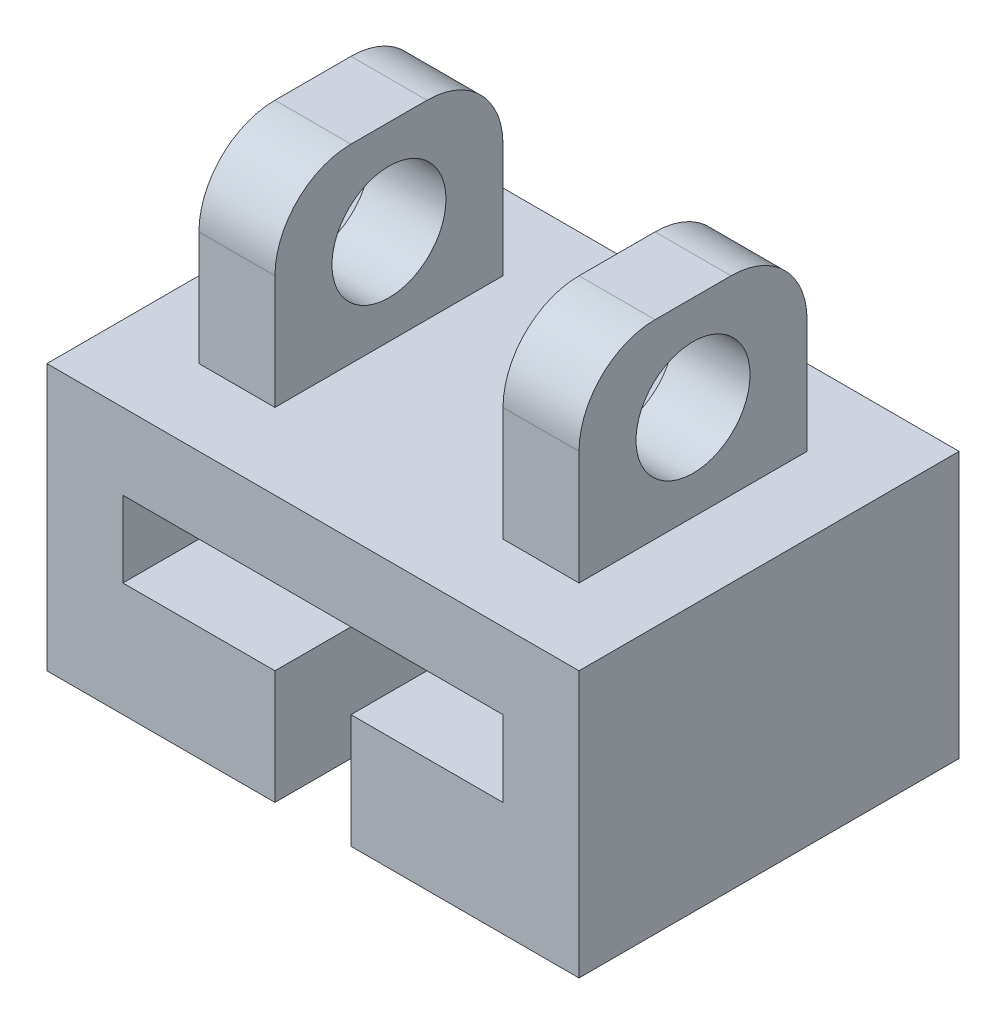
ISO-10303-21;
HEADER;
FILE_DESCRIPTION(('STEP AP214'),'2;1');
FILE_NAME('part.step','',(''),(''),'','','');
FILE_SCHEMA(('AUTOMOTIVE_DESIGN { 1 0 10303 214 1 1 1 1 }'));
ENDSEC;
DATA;
#1=APPLICATION_CONTEXT('core data for automotive mechanical design processes');
#2=APPLICATION_PROTOCOL_DEFINITION('international standard','automotive_design',2000,#1);
#3=PRODUCT_CONTEXT('',#1,'mechanical');
#4=PRODUCT('Part','Part','',(#3));
#5=PRODUCT_RELATED_PRODUCT_CATEGORY('part','',(#4));
#6=PRODUCT_DEFINITION_FORMATION('','',#4);
#7=PRODUCT_DEFINITION_CONTEXT('part definition',#1,'design');
#8=PRODUCT_DEFINITION('design','',#6,#7);
#9=PRODUCT_DEFINITION_SHAPE('','',#8);
#10=(LENGTH_UNIT() NAMED_UNIT(*) SI_UNIT(.MILLI.,.METRE.));
#11=(NAMED_UNIT(*) PLANE_ANGLE_UNIT() SI_UNIT($,.RADIAN.));
#12=(NAMED_UNIT(*) SI_UNIT($,.STERADIAN.) SOLID_ANGLE_UNIT());
#13=UNCERTAINTY_MEASURE_WITH_UNIT(LENGTH_MEASURE(1.E-05),#10,'distance_accuracy_value','');
#14=(GEOMETRIC_REPRESENTATION_CONTEXT(3) GLOBAL_UNCERTAINTY_ASSIGNED_CONTEXT((#13)) GLOBAL_UNIT_ASSIGNED_CONTEXT((#10,
#11,#12)) REPRESENTATION_CONTEXT('',''));
#15=CARTESIAN_POINT('',(0.,0.,0.));
#16=DIRECTION('',(0.,0.,1.));
#17=DIRECTION('',(1.,0.,0.));
#18=AXIS2_PLACEMENT_3D('',#15,#16,#17);
#19=CARTESIAN_POINT('',(-80.8662040418797,3.69369369369371,100.));
#20=DIRECTION('',(0.,-1.,0.));
#21=DIRECTION('',(0.,0.,-1.));
#22=AXIS2_PLACEMENT_3D('',#19,#20,#21);
#23=PLANE('',#22);
#24=DIRECTION('',(0.,0.,-1.));
#25=VECTOR('',#24,1.);
#26=CARTESIAN_POINT('',(-40.8662040418798,3.69369369369371,20.));
#27=LINE('',#26,#25);
#28=CARTESIAN_POINT('',(-40.8662040418798,3.69369369369371,80.));
#29=VERTEX_POINT('',#28);
#30=CARTESIAN_POINT('',(-40.8662040418798,3.69369369369371,20.));
#31=VERTEX_POINT('',#30);
#32=EDGE_CURVE('E243',#29,#31,#27,.T.);
#33=ORIENTED_EDGE('',*,*,#32,.F.);
#34=DIRECTION('',(1.,0.,0.));
#35=VECTOR('',#34,1.);
#36=CARTESIAN_POINT('',(-60.8662040418798,3.69369369369371,80.));
#37=LINE('',#36,#35);
#38=CARTESIAN_POINT('',(-60.8662040418798,3.69369369369371,80.));
#39=VERTEX_POINT('',#38);
#40=EDGE_CURVE('E249',#39,#29,#37,.T.);
#41=ORIENTED_EDGE('',*,*,#40,.F.);
#42=DIRECTION('',(0.,0.,1.));
#43=VECTOR('',#42,1.);
#44=CARTESIAN_POINT('',(-60.8662040418798,3.69369369369371,20.));
#45=LINE('',#44,#43);
#46=CARTESIAN_POINT('',(-60.8662040418798,3.69369369369371,20.));
#47=VERTEX_POINT('',#46);
#48=EDGE_CURVE('E261',#47,#39,#45,.T.);
#49=ORIENTED_EDGE('',*,*,#48,.F.);
#50=DIRECTION('',(-1.,0.,0.));
#51=VECTOR('',#50,1.);
#52=CARTESIAN_POINT('',(-60.8662040418798,3.69369369369371,20.));
#53=LINE('',#52,#51);
#54=EDGE_CURVE('E257',#31,#47,#53,.T.);
#55=ORIENTED_EDGE('',*,*,#54,.F.);
#56=EDGE_LOOP('',(#33,#41,#49,#55));
#57=FACE_BOUND('',#56,.T.);
#58=DIRECTION('',(-1.,0.,0.));
#59=VECTOR('',#58,1.);
#60=CARTESIAN_POINT('',(-80.8662040418797,3.69369369369371,0.));
#61=LINE('',#60,#59);
#62=CARTESIAN_POINT('',(59.1337959581202,3.69369369369371,0.));
#63=VERTEX_POINT('',#62);
#64=CARTESIAN_POINT('',(-80.8662040418797,3.69369369369371,0.));
#65=VERTEX_POINT('',#64);
#66=EDGE_CURVE('E320',#63,#65,#61,.T.);
#67=ORIENTED_EDGE('',*,*,#66,.T.);
#68=DIRECTION('',(0.,0.,-1.));
#69=VECTOR('',#68,1.);
#70=CARTESIAN_POINT('',(-80.8662040418797,3.69369369369371,100.));
#71=LINE('',#70,#69);
#72=CARTESIAN_POINT('',(-80.8662040418797,3.69369369369371,100.));
#73=VERTEX_POINT('',#72);
#74=EDGE_CURVE('E395',#73,#65,#71,.T.);
#75=ORIENTED_EDGE('',*,*,#74,.F.);
#76=DIRECTION('',(-1.,0.,0.));
#77=VECTOR('',#76,1.);
#78=CARTESIAN_POINT('',(-80.8662040418797,3.69369369369371,100.));
#79=LINE('',#78,#77);
#80=CARTESIAN_POINT('',(59.1337959581202,3.69369369369371,100.));
#81=VERTEX_POINT('',#80);
#82=EDGE_CURVE('E283',#81,#73,#79,.T.);
#83=ORIENTED_EDGE('',*,*,#82,.F.);
#84=DIRECTION('',(0.,0.,-1.));
#85=VECTOR('',#84,1.);
#86=CARTESIAN_POINT('',(59.1337959581202,3.69369369369371,100.));
#87=LINE('',#86,#85);
#88=EDGE_CURVE('E399',#81,#63,#87,.T.);
#89=ORIENTED_EDGE('',*,*,#88,.T.);
#90=EDGE_LOOP('',(#67,#75,#83,#89));
#91=FACE_BOUND('',#90,.T.);
#92=DIRECTION('',(0.,0.,-1.));
#93=VECTOR('',#92,1.);
#94=CARTESIAN_POINT('',(39.1337959581202,3.69369369369371,20.));
#95=LINE('',#94,#93);
#96=CARTESIAN_POINT('',(39.1337959581202,3.69369369369371,80.));
#97=VERTEX_POINT('',#96);
#98=CARTESIAN_POINT('',(39.1337959581202,3.69369369369371,20.));
#99=VERTEX_POINT('',#98);
#100=EDGE_CURVE('E203',#97,#99,#95,.T.);
#101=ORIENTED_EDGE('',*,*,#100,.F.);
#102=DIRECTION('',(1.,0.,0.));
#103=VECTOR('',#102,1.);
#104=CARTESIAN_POINT('',(19.1337959581202,3.69369369369371,80.));
#105=LINE('',#104,#103);
#106=CARTESIAN_POINT('',(19.1337959581202,3.69369369369371,80.));
#107=VERTEX_POINT('',#106);
#108=EDGE_CURVE('E215',#107,#97,#105,.T.);
#109=ORIENTED_EDGE('',*,*,#108,.F.);
#110=DIRECTION('',(0.,0.,1.));
#111=VECTOR('',#110,1.);
#112=CARTESIAN_POINT('',(19.1337959581202,3.69369369369371,20.));
#113=LINE('',#112,#111);
#114=CARTESIAN_POINT('',(19.1337959581202,3.69369369369371,20.));
#115=VERTEX_POINT('',#114);
#116=EDGE_CURVE('E226',#115,#107,#113,.T.);
#117=ORIENTED_EDGE('',*,*,#116,.F.);
#118=DIRECTION('',(-1.,0.,0.));
#119=VECTOR('',#118,1.);
#120=CARTESIAN_POINT('',(19.1337959581202,3.69369369369371,20.));
#121=LINE('',#120,#119);
#122=EDGE_CURVE('E218',#99,#115,#121,.T.);
#123=ORIENTED_EDGE('',*,*,#122,.F.);
#124=EDGE_LOOP('',(#101,#109,#117,#123));
#125=FACE_BOUND('',#124,.T.);
#126=ADVANCED_FACE('F39',(#57,#91,#125),#23,.F.);
#127=CARTESIAN_POINT('',(59.1337959581202,3.69369369369371,100.));
#128=DIRECTION('',(-1.,0.,0.));
#129=DIRECTION('',(0.,-1.,0.));
#130=AXIS2_PLACEMENT_3D('',#127,#128,#129);
#131=PLANE('',#130);
#132=DIRECTION('',(0.,1.,0.));
#133=VECTOR('',#132,1.);
#134=CARTESIAN_POINT('',(59.1337959581202,3.69369369369371,0.));
#135=LINE('',#134,#133);
#136=CARTESIAN_POINT('',(59.1337959581203,-66.3063063063063,0.));
#137=VERTEX_POINT('',#136);
#138=EDGE_CURVE('E279',#137,#63,#135,.T.);
#139=ORIENTED_EDGE('',*,*,#138,.T.);
#140=ORIENTED_EDGE('',*,*,#88,.F.);
#141=DIRECTION('',(0.,1.,0.));
#142=VECTOR('',#141,1.);
#143=CARTESIAN_POINT('',(59.1337959581202,-13.6936936936937,100.));
#144=LINE('',#143,#142);
#145=CARTESIAN_POINT('',(59.1337959581203,-66.3063063063063,100.));
#146=VERTEX_POINT('',#145);
#147=EDGE_CURVE('E280',#146,#81,#144,.T.);
#148=ORIENTED_EDGE('',*,*,#147,.F.);
#149=DIRECTION('',(0.,0.,-1.));
#150=VECTOR('',#149,1.);
#151=CARTESIAN_POINT('',(59.1337959581203,-66.3063063063063,100.));
#152=LINE('',#151,#150);
#153=EDGE_CURVE('E317',#146,#137,#152,.T.);
#154=ORIENTED_EDGE('',*,*,#153,.T.);
#155=EDGE_LOOP('',(#139,#140,#148,#154));
#156=FACE_BOUND('',#155,.T.);
#157=ADVANCED_FACE('F494',(#156),#131,.F.);
#158=CARTESIAN_POINT('',(-80.8662040418798,-13.6936936936937,100.));
#159=DIRECTION('',(1.,0.,0.));
#160=DIRECTION('',(0.,1.,0.));
#161=AXIS2_PLACEMENT_3D('',#158,#159,#160);
#162=PLANE('',#161);
#163=DIRECTION('',(0.,-1.,0.));
#164=VECTOR('',#163,1.);
#165=CARTESIAN_POINT('',(-80.8662040418798,-13.6936936936937,0.));
#166=LINE('',#165,#164);
#167=CARTESIAN_POINT('',(-80.8662040418798,-66.3063063063063,0.));
#168=VERTEX_POINT('',#167);
#169=EDGE_CURVE('E324',#65,#168,#166,.T.);
#170=ORIENTED_EDGE('',*,*,#169,.T.);
#171=DIRECTION('',(0.,0.,-1.));
#172=VECTOR('',#171,1.);
#173=CARTESIAN_POINT('',(-80.8662040418798,-66.3063063063063,100.));
#174=LINE('',#173,#172);
#175=CARTESIAN_POINT('',(-80.8662040418798,-66.3063063063063,100.));
#176=VERTEX_POINT('',#175);
#177=EDGE_CURVE('E391',#176,#168,#174,.T.);
#178=ORIENTED_EDGE('',*,*,#177,.F.);
#179=DIRECTION('',(0.,-1.,0.));
#180=VECTOR('',#179,1.);
#181=CARTESIAN_POINT('',(-80.8662040418797,3.69369369369371,100.));
#182=LINE('',#181,#180);
#183=EDGE_CURVE('E287',#73,#176,#182,.T.);
#184=ORIENTED_EDGE('',*,*,#183,.F.);
#185=ORIENTED_EDGE('',*,*,#74,.T.);
#186=EDGE_LOOP('',(#170,#178,#184,#185));
#187=FACE_BOUND('',#186,.T.);
#188=ADVANCED_FACE('F502',(#187),#162,.F.);
#189=CARTESIAN_POINT('',(-60.,-66.3063063063063,100.));
#190=DIRECTION('',(0.,1.,0.));
#191=DIRECTION('',(0.,0.,1.));
#192=AXIS2_PLACEMENT_3D('',#189,#190,#191);
#193=PLANE('',#192);
#194=DIRECTION('',(1.,0.,0.));
#195=VECTOR('',#194,1.);
#196=CARTESIAN_POINT('',(-60.,-66.3063063063063,0.));
#197=LINE('',#196,#195);
#198=CARTESIAN_POINT('',(-20.8662040418798,-66.3063063063063,0.));
#199=VERTEX_POINT('',#198);
#200=EDGE_CURVE('E328',#168,#199,#197,.T.);
#201=ORIENTED_EDGE('',*,*,#200,.T.);
#202=DIRECTION('',(0.,0.,-1.));
#203=VECTOR('',#202,1.);
#204=CARTESIAN_POINT('',(-20.8662040418798,-66.3063063063063,100.));
#205=LINE('',#204,#203);
#206=CARTESIAN_POINT('',(-20.8662040418798,-66.3063063063063,100.));
#207=VERTEX_POINT('',#206);
#208=EDGE_CURVE('E387',#207,#199,#205,.T.);
#209=ORIENTED_EDGE('',*,*,#208,.F.);
#210=DIRECTION('',(1.,0.,0.));
#211=VECTOR('',#210,1.);
#212=CARTESIAN_POINT('',(-80.8662040418798,-66.3063063063063,100.));
#213=LINE('',#212,#211);
#214=EDGE_CURVE('E290',#176,#207,#213,.T.);
#215=ORIENTED_EDGE('',*,*,#214,.F.);
#216=ORIENTED_EDGE('',*,*,#177,.T.);
#217=EDGE_LOOP('',(#201,#209,#215,#216));
#218=FACE_BOUND('',#217,.T.);
#219=ADVANCED_FACE('F663',(#218),#193,.F.);
#220=CARTESIAN_POINT('',(-20.8662040418798,-66.3063063063063,100.));
#221=DIRECTION('',(-1.,0.,0.));
#222=DIRECTION('',(0.,0.,1.));
#223=AXIS2_PLACEMENT_3D('',#220,#221,#222);
#224=PLANE('',#223);
#225=DIRECTION('',(0.,1.,0.));
#226=VECTOR('',#225,1.);
#227=CARTESIAN_POINT('',(-20.8662040418798,-66.3063063063063,0.));
#228=LINE('',#227,#226);
#229=CARTESIAN_POINT('',(-20.8662040418798,-36.3063063063063,0.));
#230=VERTEX_POINT('',#229);
#231=EDGE_CURVE('E331',#199,#230,#228,.T.);
#232=ORIENTED_EDGE('',*,*,#231,.T.);
#233=DIRECTION('',(0.,0.,-1.));
#234=VECTOR('',#233,1.);
#235=CARTESIAN_POINT('',(-20.8662040418798,-36.3063063063063,100.));
#236=LINE('',#235,#234);
#237=CARTESIAN_POINT('',(-20.8662040418798,-36.3063063063063,100.));
#238=VERTEX_POINT('',#237);
#239=EDGE_CURVE('E383',#238,#230,#236,.T.);
#240=ORIENTED_EDGE('',*,*,#239,.F.);
#241=DIRECTION('',(0.,1.,0.));
#242=VECTOR('',#241,1.);
#243=CARTESIAN_POINT('',(-20.8662040418798,-66.3063063063063,100.));
#244=LINE('',#243,#242);
#245=EDGE_CURVE('E293',#207,#238,#244,.T.);
#246=ORIENTED_EDGE('',*,*,#245,.F.);
#247=ORIENTED_EDGE('',*,*,#208,.T.);
#248=EDGE_LOOP('',(#232,#240,#246,#247));
#249=FACE_BOUND('',#248,.T.);
#250=ADVANCED_FACE('F660',(#249),#224,.F.);
#251=CARTESIAN_POINT('',(-60.8662040418798,-36.3063063063063,100.));
#252=DIRECTION('',(0.,-1.,0.));
#253=DIRECTION('',(0.,0.,-1.));
#254=AXIS2_PLACEMENT_3D('',#251,#252,#253);
#255=PLANE('',#254);
#256=DIRECTION('',(-1.,0.,0.));
#257=VECTOR('',#256,1.);
#258=CARTESIAN_POINT('',(-60.8662040418798,-36.3063063063063,0.));
#259=LINE('',#258,#257);
#260=CARTESIAN_POINT('',(-60.8662040418798,-36.3063063063063,0.));
#261=VERTEX_POINT('',#260);
#262=EDGE_CURVE('E334',#230,#261,#259,.T.);
#263=ORIENTED_EDGE('',*,*,#262,.T.);
#264=DIRECTION('',(0.,0.,-1.));
#265=VECTOR('',#264,1.);
#266=CARTESIAN_POINT('',(-60.8662040418798,-36.3063063063063,100.));
#267=LINE('',#266,#265);
#268=CARTESIAN_POINT('',(-60.8662040418798,-36.3063063063063,100.));
#269=VERTEX_POINT('',#268);
#270=EDGE_CURVE('E379',#269,#261,#267,.T.);
#271=ORIENTED_EDGE('',*,*,#270,.F.);
#272=DIRECTION('',(-1.,0.,0.));
#273=VECTOR('',#272,1.);
#274=CARTESIAN_POINT('',(-60.8662040418798,-36.3063063063063,100.));
#275=LINE('',#274,#273);
#276=EDGE_CURVE('E296',#238,#269,#275,.T.);
#277=ORIENTED_EDGE('',*,*,#276,.F.);
#278=ORIENTED_EDGE('',*,*,#239,.T.);
#279=EDGE_LOOP('',(#263,#271,#277,#278));
#280=FACE_BOUND('',#279,.T.);
#281=ADVANCED_FACE('F656',(#280),#255,.F.);
#282=CARTESIAN_POINT('',(-60.8662040418798,-16.3063063063063,100.));
#283=DIRECTION('',(-1.,0.,0.));
#284=DIRECTION('',(0.,0.,1.));
#285=AXIS2_PLACEMENT_3D('',#282,#283,#284);
#286=PLANE('',#285);
#287=DIRECTION('',(0.,1.,0.));
#288=VECTOR('',#287,1.);
#289=CARTESIAN_POINT('',(-60.8662040418798,-16.3063063063063,0.));
#290=LINE('',#289,#288);
#291=CARTESIAN_POINT('',(-60.8662040418798,-16.3063063063063,0.));
#292=VERTEX_POINT('',#291);
#293=EDGE_CURVE('E337',#261,#292,#290,.T.);
#294=ORIENTED_EDGE('',*,*,#293,.T.);
#295=DIRECTION('',(0.,0.,-1.));
#296=VECTOR('',#295,1.);
#297=CARTESIAN_POINT('',(-60.8662040418798,-16.3063063063063,100.));
#298=LINE('',#297,#296);
#299=CARTESIAN_POINT('',(-60.8662040418798,-16.3063063063063,100.));
#300=VERTEX_POINT('',#299);
#301=EDGE_CURVE('E375',#300,#292,#298,.T.);
#302=ORIENTED_EDGE('',*,*,#301,.F.);
#303=DIRECTION('',(0.,1.,0.));
#304=VECTOR('',#303,1.);
#305=CARTESIAN_POINT('',(-60.8662040418798,-16.3063063063063,100.));
#306=LINE('',#305,#304);
#307=EDGE_CURVE('E299',#269,#300,#306,.T.);
#308=ORIENTED_EDGE('',*,*,#307,.F.);
#309=ORIENTED_EDGE('',*,*,#270,.T.);
#310=EDGE_LOOP('',(#294,#302,#308,#309));
#311=FACE_BOUND('',#310,.T.);
#312=ADVANCED_FACE('F652',(#311),#286,.F.);
#313=CARTESIAN_POINT('',(-60.8662040418798,-16.3063063063063,100.));
#314=DIRECTION('',(0.,1.,0.));
#315=DIRECTION('',(0.,0.,1.));
#316=AXIS2_PLACEMENT_3D('',#313,#314,#315);
#317=PLANE('',#316);
#318=DIRECTION('',(1.,0.,0.));
#319=VECTOR('',#318,1.);
#320=CARTESIAN_POINT('',(-60.8662040418798,-16.3063063063063,0.));
#321=LINE('',#320,#319);
#322=CARTESIAN_POINT('',(39.1337959581202,-16.3063063063063,0.));
#323=VERTEX_POINT('',#322);
#324=EDGE_CURVE('E340',#292,#323,#321,.T.);
#325=ORIENTED_EDGE('',*,*,#324,.T.);
#326=DIRECTION('',(0.,0.,-1.));
#327=VECTOR('',#326,1.);
#328=CARTESIAN_POINT('',(39.1337959581202,-16.3063063063063,100.));
#329=LINE('',#328,#327);
#330=CARTESIAN_POINT('',(39.1337959581202,-16.3063063063063,100.));
#331=VERTEX_POINT('',#330);
#332=EDGE_CURVE('E371',#331,#323,#329,.T.);
#333=ORIENTED_EDGE('',*,*,#332,.F.);
#334=DIRECTION('',(1.,0.,0.));
#335=VECTOR('',#334,1.);
#336=CARTESIAN_POINT('',(-60.8662040418798,-16.3063063063063,100.));
#337=LINE('',#336,#335);
#338=EDGE_CURVE('E302',#300,#331,#337,.T.);
#339=ORIENTED_EDGE('',*,*,#338,.F.);
#340=ORIENTED_EDGE('',*,*,#301,.T.);
#341=EDGE_LOOP('',(#325,#333,#339,#340));
#342=FACE_BOUND('',#341,.T.);
#343=ADVANCED_FACE('F648',(#342),#317,.F.);
#344=CARTESIAN_POINT('',(39.1337959581202,-16.3063063063063,100.));
#345=DIRECTION('',(1.,0.,0.));
#346=DIRECTION('',(0.,0.,-1.));
#347=AXIS2_PLACEMENT_3D('',#344,#345,#346);
#348=PLANE('',#347);
#349=DIRECTION('',(0.,-1.,0.));
#350=VECTOR('',#349,1.);
#351=CARTESIAN_POINT('',(39.1337959581202,-16.3063063063063,0.));
#352=LINE('',#351,#350);
#353=CARTESIAN_POINT('',(39.1337959581202,-36.3063063063063,0.));
#354=VERTEX_POINT('',#353);
#355=EDGE_CURVE('E343',#323,#354,#352,.T.);
#356=ORIENTED_EDGE('',*,*,#355,.T.);
#357=DIRECTION('',(0.,0.,-1.));
#358=VECTOR('',#357,1.);
#359=CARTESIAN_POINT('',(39.1337959581202,-36.3063063063063,100.));
#360=LINE('',#359,#358);
#361=CARTESIAN_POINT('',(39.1337959581202,-36.3063063063063,100.));
#362=VERTEX_POINT('',#361);
#363=EDGE_CURVE('E367',#362,#354,#360,.T.);
#364=ORIENTED_EDGE('',*,*,#363,.F.);
#365=DIRECTION('',(0.,-1.,0.));
#366=VECTOR('',#365,1.);
#367=CARTESIAN_POINT('',(39.1337959581202,-16.3063063063063,100.));
#368=LINE('',#367,#366);
#369=EDGE_CURVE('E305',#331,#362,#368,.T.);
#370=ORIENTED_EDGE('',*,*,#369,.F.);
#371=ORIENTED_EDGE('',*,*,#332,.T.);
#372=EDGE_LOOP('',(#356,#364,#370,#371));
#373=FACE_BOUND('',#372,.T.);
#374=ADVANCED_FACE('F644',(#373),#348,.F.);
#375=CARTESIAN_POINT('',(39.1337959581202,-36.3063063063063,100.));
#376=DIRECTION('',(0.,-1.,0.));
#377=DIRECTION('',(0.,0.,-1.));
#378=AXIS2_PLACEMENT_3D('',#375,#376,#377);
#379=PLANE('',#378);
#380=DIRECTION('',(-1.,0.,0.));
#381=VECTOR('',#380,1.);
#382=CARTESIAN_POINT('',(39.1337959581202,-36.3063063063063,0.));
#383=LINE('',#382,#381);
#384=CARTESIAN_POINT('',(-0.866204041879759,-36.3063063063063,0.));
#385=VERTEX_POINT('',#384);
#386=EDGE_CURVE('E346',#354,#385,#383,.T.);
#387=ORIENTED_EDGE('',*,*,#386,.T.);
#388=DIRECTION('',(0.,0.,-1.));
#389=VECTOR('',#388,1.);
#390=CARTESIAN_POINT('',(-0.866204041879759,-36.3063063063063,100.));
#391=LINE('',#390,#389);
#392=CARTESIAN_POINT('',(-0.866204041879759,-36.3063063063063,100.));
#393=VERTEX_POINT('',#392);
#394=EDGE_CURVE('E363',#393,#385,#391,.T.);
#395=ORIENTED_EDGE('',*,*,#394,.F.);
#396=DIRECTION('',(-1.,0.,0.));
#397=VECTOR('',#396,1.);
#398=CARTESIAN_POINT('',(39.1337959581202,-36.3063063063063,100.));
#399=LINE('',#398,#397);
#400=EDGE_CURVE('E308',#362,#393,#399,.T.);
#401=ORIENTED_EDGE('',*,*,#400,.F.);
#402=ORIENTED_EDGE('',*,*,#363,.T.);
#403=EDGE_LOOP('',(#387,#395,#401,#402));
#404=FACE_BOUND('',#403,.T.);
#405=ADVANCED_FACE('F640',(#404),#379,.F.);
#406=CARTESIAN_POINT('',(-0.866204041879759,-66.3063063063063,100.));
#407=DIRECTION('',(1.,0.,0.));
#408=DIRECTION('',(0.,0.,-1.));
#409=AXIS2_PLACEMENT_3D('',#406,#407,#408);
#410=PLANE('',#409);
#411=DIRECTION('',(0.,-1.,0.));
#412=VECTOR('',#411,1.);
#413=CARTESIAN_POINT('',(-0.866204041879759,-66.3063063063063,0.));
#414=LINE('',#413,#412);
#415=CARTESIAN_POINT('',(-0.866204041879759,-66.3063063063063,0.));
#416=VERTEX_POINT('',#415);
#417=EDGE_CURVE('E349',#385,#416,#414,.T.);
#418=ORIENTED_EDGE('',*,*,#417,.T.);
#419=DIRECTION('',(0.,0.,-1.));
#420=VECTOR('',#419,1.);
#421=CARTESIAN_POINT('',(-0.866204041879759,-66.3063063063063,100.));
#422=LINE('',#421,#420);
#423=CARTESIAN_POINT('',(-0.866204041879759,-66.3063063063063,100.));
#424=VERTEX_POINT('',#423);
#425=EDGE_CURVE('E359',#424,#416,#422,.T.);
#426=ORIENTED_EDGE('',*,*,#425,.F.);
#427=DIRECTION('',(0.,-1.,0.));
#428=VECTOR('',#427,1.);
#429=CARTESIAN_POINT('',(-0.866204041879759,-66.3063063063063,100.));
#430=LINE('',#429,#428);
#431=EDGE_CURVE('E311',#393,#424,#430,.T.);
#432=ORIENTED_EDGE('',*,*,#431,.F.);
#433=ORIENTED_EDGE('',*,*,#394,.T.);
#434=EDGE_LOOP('',(#418,#426,#432,#433));
#435=FACE_BOUND('',#434,.T.);
#436=ADVANCED_FACE('F636',(#435),#410,.F.);
#437=CARTESIAN_POINT('',(59.1337959581203,-66.3063063063063,100.));
#438=DIRECTION('',(0.,1.,0.));
#439=DIRECTION('',(0.,0.,1.));
#440=AXIS2_PLACEMENT_3D('',#437,#438,#439);
#441=PLANE('',#440);
#442=DIRECTION('',(1.,0.,0.));
#443=VECTOR('',#442,1.);
#444=CARTESIAN_POINT('',(59.1337959581203,-66.3063063063063,0.));
#445=LINE('',#444,#443);
#446=EDGE_CURVE('E284',#416,#137,#445,.T.);
#447=ORIENTED_EDGE('',*,*,#446,.T.);
#448=ORIENTED_EDGE('',*,*,#153,.F.);
#449=DIRECTION('',(1.,0.,0.));
#450=VECTOR('',#449,1.);
#451=CARTESIAN_POINT('',(38.2675919162405,-66.3063063063063,100.));
#452=LINE('',#451,#450);
#453=EDGE_CURVE('E314',#424,#146,#452,.T.);
#454=ORIENTED_EDGE('',*,*,#453,.F.);
#455=ORIENTED_EDGE('',*,*,#425,.T.);
#456=EDGE_LOOP('',(#447,#448,#454,#455));
#457=FACE_BOUND('',#456,.T.);
#458=ADVANCED_FACE('F629',(#457),#441,.F.);
#459=CARTESIAN_POINT('',(0.,0.,100.));
#460=DIRECTION('',(0.,0.,-1.));
#461=DIRECTION('',(-1.,0.,0.));
#462=AXIS2_PLACEMENT_3D('',#459,#460,#461);
#463=PLANE('',#462);
#464=ORIENTED_EDGE('',*,*,#147,.T.);
#465=ORIENTED_EDGE('',*,*,#82,.T.);
#466=ORIENTED_EDGE('',*,*,#183,.T.);
#467=ORIENTED_EDGE('',*,*,#214,.T.);
#468=ORIENTED_EDGE('',*,*,#245,.T.);
#469=ORIENTED_EDGE('',*,*,#276,.T.);
#470=ORIENTED_EDGE('',*,*,#307,.T.);
#471=ORIENTED_EDGE('',*,*,#338,.T.);
#472=ORIENTED_EDGE('',*,*,#369,.T.);
#473=ORIENTED_EDGE('',*,*,#400,.T.);
#474=ORIENTED_EDGE('',*,*,#431,.T.);
#475=ORIENTED_EDGE('',*,*,#453,.T.);
#476=EDGE_LOOP('',(#464,#465,#466,#467,#468,#469,#470,#471,#472,#473,#474,#475));
#477=FACE_BOUND('',#476,.T.);
#478=ADVANCED_FACE('F626',(#477),#463,.F.);
#479=CARTESIAN_POINT('',(0.,0.,0.));
#480=DIRECTION('',(0.,0.,-1.));
#481=DIRECTION('',(-1.,0.,0.));
#482=AXIS2_PLACEMENT_3D('',#479,#480,#481);
#483=PLANE('',#482);
#484=ORIENTED_EDGE('',*,*,#138,.F.);
#485=ORIENTED_EDGE('',*,*,#446,.F.);
#486=ORIENTED_EDGE('',*,*,#417,.F.);
#487=ORIENTED_EDGE('',*,*,#386,.F.);
#488=ORIENTED_EDGE('',*,*,#355,.F.);
#489=ORIENTED_EDGE('',*,*,#324,.F.);
#490=ORIENTED_EDGE('',*,*,#293,.F.);
#491=ORIENTED_EDGE('',*,*,#262,.F.);
#492=ORIENTED_EDGE('',*,*,#231,.F.);
#493=ORIENTED_EDGE('',*,*,#200,.F.);
#494=ORIENTED_EDGE('',*,*,#169,.F.);
#495=ORIENTED_EDGE('',*,*,#66,.F.);
#496=EDGE_LOOP('',(#484,#485,#486,#487,#488,#489,#490,#491,#492,#493,#494,#495));
#497=FACE_BOUND('',#496,.T.);
#498=ADVANCED_FACE('F538',(#497),#483,.T.);
#499=CARTESIAN_POINT('',(-40.8662040418798,53.6936936936937,20.));
#500=DIRECTION('',(-1.,0.,0.));
#501=DIRECTION('',(0.,0.,1.));
#502=AXIS2_PLACEMENT_3D('',#499,#500,#501);
#503=PLANE('',#502);
#504=CARTESIAN_POINT('',(-40.8662040418798,28.6936936936937,50.));
#505=DIRECTION('',(-1.,0.,0.));
#506=DIRECTION('',(0.,0.,1.));
#507=AXIS2_PLACEMENT_3D('',#504,#505,#506);
#508=CIRCLE('',#507,15.);
#509=CARTESIAN_POINT('',(-40.8662040418798,28.6936936936937,35.));
#510=VERTEX_POINT('',#509);
#511=EDGE_CURVE('E220',#510,#510,#508,.T.);
#512=ORIENTED_EDGE('',*,*,#511,.T.);
#513=EDGE_LOOP('',(#512));
#514=FACE_BOUND('',#513,.T.);
#515=DIRECTION('',(0.,0.,-1.));
#516=VECTOR('',#515,1.);
#517=CARTESIAN_POINT('',(-40.8662040418798,53.6936936936937,20.));
#518=LINE('',#517,#516);
#519=CARTESIAN_POINT('',(-40.8662040418798,53.6936936936937,60.));
#520=VERTEX_POINT('',#519);
#521=CARTESIAN_POINT('',(-40.8662040418798,53.6936936936937,40.));
#522=VERTEX_POINT('',#521);
#523=EDGE_CURVE('E244',#520,#522,#518,.T.);
#524=ORIENTED_EDGE('',*,*,#523,.F.);
#525=CARTESIAN_POINT('',(-40.8662040418798,33.6936936936937,60.));
#526=DIRECTION('',(-1.,0.,0.));
#527=DIRECTION('',(0.,0.,1.));
#528=AXIS2_PLACEMENT_3D('',#525,#526,#527);
#529=CIRCLE('',#528,20.);
#530=CARTESIAN_POINT('',(-40.8662040418798,33.6936936936937,80.));
#531=VERTEX_POINT('',#530);
#532=EDGE_CURVE('E414',#520,#531,#529,.F.);
#533=ORIENTED_EDGE('',*,*,#532,.T.);
#534=DIRECTION('',(0.,-1.,0.));
#535=VECTOR('',#534,1.);
#536=CARTESIAN_POINT('',(-40.8662040418798,53.6936936936937,80.));
#537=LINE('',#536,#535);
#538=EDGE_CURVE('E253',#531,#29,#537,.T.);
#539=ORIENTED_EDGE('',*,*,#538,.T.);
#540=ORIENTED_EDGE('',*,*,#32,.T.);
#541=DIRECTION('',(0.,-1.,0.));
#542=VECTOR('',#541,1.);
#543=CARTESIAN_POINT('',(-40.8662040418798,53.6936936936937,20.));
#544=LINE('',#543,#542);
#545=CARTESIAN_POINT('',(-40.8662040418798,33.6936936936937,20.));
#546=VERTEX_POINT('',#545);
#547=EDGE_CURVE('E276',#546,#31,#544,.T.);
#548=ORIENTED_EDGE('',*,*,#547,.F.);
#549=CARTESIAN_POINT('',(-40.8662040418798,33.6936936936937,40.));
#550=DIRECTION('',(-1.,0.,0.));
#551=DIRECTION('',(0.,0.,1.));
#552=AXIS2_PLACEMENT_3D('',#549,#550,#551);
#553=CIRCLE('',#552,20.);
#554=EDGE_CURVE('E411',#546,#522,#553,.F.);
#555=ORIENTED_EDGE('',*,*,#554,.T.);
#556=EDGE_LOOP('',(#524,#533,#539,#540,#548,#555));
#557=FACE_BOUND('',#556,.T.);
#558=ADVANCED_FACE('F532',(#514,#557),#503,.F.);
#559=CARTESIAN_POINT('',(-60.8662040418798,53.6936936936937,20.));
#560=DIRECTION('',(0.,0.,1.));
#561=DIRECTION('',(1.,0.,0.));
#562=AXIS2_PLACEMENT_3D('',#559,#560,#561);
#563=PLANE('',#562);
#564=DIRECTION('',(0.,-1.,0.));
#565=VECTOR('',#564,1.);
#566=CARTESIAN_POINT('',(-60.8662040418798,53.6936936936937,20.));
#567=LINE('',#566,#565);
#568=CARTESIAN_POINT('',(-60.8662040418798,33.6936936936937,20.));
#569=VERTEX_POINT('',#568);
#570=EDGE_CURVE('E273',#569,#47,#567,.T.);
#571=ORIENTED_EDGE('',*,*,#570,.F.);
#572=DIRECTION('',(-1.,0.,0.));
#573=VECTOR('',#572,1.);
#574=CARTESIAN_POINT('',(-40.8662040418798,33.6936936936937,20.));
#575=LINE('',#574,#573);
#576=EDGE_CURVE('E426',#569,#546,#575,.F.);
#577=ORIENTED_EDGE('',*,*,#576,.T.);
#578=ORIENTED_EDGE('',*,*,#547,.T.);
#579=ORIENTED_EDGE('',*,*,#54,.T.);
#580=EDGE_LOOP('',(#571,#577,#578,#579));
#581=FACE_BOUND('',#580,.T.);
#582=ADVANCED_FACE('F537',(#581),#563,.F.);
#583=CARTESIAN_POINT('',(-60.8662040418798,53.6936936936937,20.));
#584=DIRECTION('',(1.,0.,0.));
#585=DIRECTION('',(0.,0.,-1.));
#586=AXIS2_PLACEMENT_3D('',#583,#584,#585);
#587=PLANE('',#586);
#588=CARTESIAN_POINT('',(-60.8662040418798,28.6936936936937,50.));
#589=DIRECTION('',(1.,0.,0.));
#590=DIRECTION('',(0.,0.,-1.));
#591=AXIS2_PLACEMENT_3D('',#588,#589,#590);
#592=CIRCLE('',#591,15.);
#593=CARTESIAN_POINT('',(-60.8662040418798,28.6936936936937,35.));
#594=VERTEX_POINT('',#593);
#595=EDGE_CURVE('E471',#594,#594,#592,.T.);
#596=ORIENTED_EDGE('',*,*,#595,.T.);
#597=EDGE_LOOP('',(#596));
#598=FACE_BOUND('',#597,.T.);
#599=DIRECTION('',(0.,-1.,0.));
#600=VECTOR('',#599,1.);
#601=CARTESIAN_POINT('',(-60.8662040418798,53.6936936936937,80.));
#602=LINE('',#601,#600);
#603=CARTESIAN_POINT('',(-60.8662040418798,33.6936936936937,80.));
#604=VERTEX_POINT('',#603);
#605=EDGE_CURVE('E270',#604,#39,#602,.T.);
#606=ORIENTED_EDGE('',*,*,#605,.F.);
#607=CARTESIAN_POINT('',(-60.8662040418798,33.6936936936937,60.));
#608=DIRECTION('',(1.,0.,0.));
#609=DIRECTION('',(0.,0.,-1.));
#610=AXIS2_PLACEMENT_3D('',#607,#608,#609);
#611=CIRCLE('',#610,20.);
#612=CARTESIAN_POINT('',(-60.8662040418798,53.6936936936937,60.));
#613=VERTEX_POINT('',#612);
#614=EDGE_CURVE('E423',#604,#613,#611,.F.);
#615=ORIENTED_EDGE('',*,*,#614,.T.);
#616=DIRECTION('',(0.,0.,1.));
#617=VECTOR('',#616,1.);
#618=CARTESIAN_POINT('',(-60.8662040418798,53.6936936936937,20.));
#619=LINE('',#618,#617);
#620=CARTESIAN_POINT('',(-60.8662040418798,53.6936936936937,40.));
#621=VERTEX_POINT('',#620);
#622=EDGE_CURVE('E248',#621,#613,#619,.T.);
#623=ORIENTED_EDGE('',*,*,#622,.F.);
#624=CARTESIAN_POINT('',(-60.8662040418798,33.6936936936937,40.));
#625=DIRECTION('',(1.,0.,0.));
#626=DIRECTION('',(0.,0.,-1.));
#627=AXIS2_PLACEMENT_3D('',#624,#625,#626);
#628=CIRCLE('',#627,20.);
#629=EDGE_CURVE('E420',#621,#569,#628,.F.);
#630=ORIENTED_EDGE('',*,*,#629,.T.);
#631=ORIENTED_EDGE('',*,*,#570,.T.);
#632=ORIENTED_EDGE('',*,*,#48,.T.);
#633=EDGE_LOOP('',(#606,#615,#623,#630,#631,#632));
#634=FACE_BOUND('',#633,.T.);
#635=ADVANCED_FACE('F547',(#598,#634),#587,.F.);
#636=CARTESIAN_POINT('',(-60.8662040418798,53.6936936936937,80.));
#637=DIRECTION('',(0.,0.,-1.));
#638=DIRECTION('',(-1.,0.,0.));
#639=AXIS2_PLACEMENT_3D('',#636,#637,#638);
#640=PLANE('',#639);
#641=ORIENTED_EDGE('',*,*,#538,.F.);
#642=DIRECTION('',(1.,0.,0.));
#643=VECTOR('',#642,1.);
#644=CARTESIAN_POINT('',(-60.8662040418798,33.6936936936937,80.));
#645=LINE('',#644,#643);
#646=EDGE_CURVE('E417',#531,#604,#645,.F.);
#647=ORIENTED_EDGE('',*,*,#646,.T.);
#648=ORIENTED_EDGE('',*,*,#605,.T.);
#649=ORIENTED_EDGE('',*,*,#40,.T.);
#650=EDGE_LOOP('',(#641,#647,#648,#649));
#651=FACE_BOUND('',#650,.T.);
#652=ADVANCED_FACE('F552',(#651),#640,.F.);
#653=CARTESIAN_POINT('',(0.,53.6936936936937,0.));
#654=DIRECTION('',(0.,1.,0.));
#655=DIRECTION('',(0.,0.,1.));
#656=AXIS2_PLACEMENT_3D('',#653,#654,#655);
#657=PLANE('',#656);
#658=ORIENTED_EDGE('',*,*,#622,.T.);
#659=DIRECTION('',(1.,0.,0.));
#660=VECTOR('',#659,1.);
#661=CARTESIAN_POINT('',(-40.8662040418798,53.6936936936937,60.));
#662=LINE('',#661,#660);
#663=EDGE_CURVE('E407',#613,#520,#662,.T.);
#664=ORIENTED_EDGE('',*,*,#663,.T.);
#665=ORIENTED_EDGE('',*,*,#523,.T.);
#666=DIRECTION('',(-1.,0.,0.));
#667=VECTOR('',#666,1.);
#668=CARTESIAN_POINT('',(-60.8662040418798,53.6936936936937,40.));
#669=LINE('',#668,#667);
#670=EDGE_CURVE('E403',#522,#621,#669,.T.);
#671=ORIENTED_EDGE('',*,*,#670,.T.);
#672=EDGE_LOOP('',(#658,#664,#665,#671));
#673=FACE_BOUND('',#672,.T.);
#674=ADVANCED_FACE('F563',(#673),#657,.T.);
#675=CARTESIAN_POINT('',(39.1337959581202,53.6936936936937,20.));
#676=DIRECTION('',(-1.,0.,0.));
#677=DIRECTION('',(0.,0.,1.));
#678=AXIS2_PLACEMENT_3D('',#675,#676,#677);
#679=PLANE('',#678);
#680=CARTESIAN_POINT('',(39.1337959581202,28.6936936936937,50.));
#681=DIRECTION('',(1.,0.,0.));
#682=DIRECTION('',(0.,0.,-1.));
#683=AXIS2_PLACEMENT_3D('',#680,#681,#682);
#684=CIRCLE('',#683,15.);
#685=CARTESIAN_POINT('',(39.1337959581202,28.6936936936937,35.));
#686=VERTEX_POINT('',#685);
#687=EDGE_CURVE('E467',#686,#686,#684,.T.);
#688=ORIENTED_EDGE('',*,*,#687,.F.);
#689=EDGE_LOOP('',(#688));
#690=FACE_BOUND('',#689,.T.);
#691=DIRECTION('',(0.,-1.,0.));
#692=VECTOR('',#691,1.);
#693=CARTESIAN_POINT('',(39.1337959581202,53.6936936936937,20.));
#694=LINE('',#693,#692);
#695=CARTESIAN_POINT('',(39.1337959581202,33.6936936936937,20.));
#696=VERTEX_POINT('',#695);
#697=EDGE_CURVE('E240',#696,#99,#694,.T.);
#698=ORIENTED_EDGE('',*,*,#697,.F.);
#699=CARTESIAN_POINT('',(39.1337959581202,33.6936936936937,40.));
#700=DIRECTION('',(-1.,0.,0.));
#701=DIRECTION('',(0.,0.,1.));
#702=AXIS2_PLACEMENT_3D('',#699,#700,#701);
#703=CIRCLE('',#702,20.);
#704=CARTESIAN_POINT('',(39.1337959581202,53.6936936936937,40.));
#705=VERTEX_POINT('',#704);
#706=EDGE_CURVE('E49',#696,#705,#703,.F.);
#707=ORIENTED_EDGE('',*,*,#706,.T.);
#708=DIRECTION('',(0.,0.,-1.));
#709=VECTOR('',#708,1.);
#710=CARTESIAN_POINT('',(39.1337959581202,53.6936936936937,20.));
#711=LINE('',#710,#709);
#712=CARTESIAN_POINT('',(39.1337959581202,53.6936936936937,60.));
#713=VERTEX_POINT('',#712);
#714=EDGE_CURVE('E225',#713,#705,#711,.T.);
#715=ORIENTED_EDGE('',*,*,#714,.F.);
#716=CARTESIAN_POINT('',(39.1337959581202,33.6936936936937,60.));
#717=DIRECTION('',(-1.,0.,0.));
#718=DIRECTION('',(0.,0.,1.));
#719=AXIS2_PLACEMENT_3D('',#716,#717,#718);
#720=CIRCLE('',#719,20.);
#721=CARTESIAN_POINT('',(39.1337959581202,33.6936936936937,80.));
#722=VERTEX_POINT('',#721);
#723=EDGE_CURVE('E56',#713,#722,#720,.F.);
#724=ORIENTED_EDGE('',*,*,#723,.T.);
#725=DIRECTION('',(0.,-1.,0.));
#726=VECTOR('',#725,1.);
#727=CARTESIAN_POINT('',(39.1337959581202,53.6936936936937,80.));
#728=LINE('',#727,#726);
#729=EDGE_CURVE('E200',#722,#97,#728,.T.);
#730=ORIENTED_EDGE('',*,*,#729,.T.);
#731=ORIENTED_EDGE('',*,*,#100,.T.);
#732=EDGE_LOOP('',(#698,#707,#715,#724,#730,#731));
#733=FACE_BOUND('',#732,.T.);
#734=ADVANCED_FACE('F202',(#690,#733),#679,.F.);
#735=CARTESIAN_POINT('',(19.1337959581202,53.6936936936937,20.));
#736=DIRECTION('',(0.,0.,1.));
#737=DIRECTION('',(1.,0.,0.));
#738=AXIS2_PLACEMENT_3D('',#735,#736,#737);
#739=PLANE('',#738);
#740=DIRECTION('',(0.,-1.,0.));
#741=VECTOR('',#740,1.);
#742=CARTESIAN_POINT('',(19.1337959581202,53.6936936936937,20.));
#743=LINE('',#742,#741);
#744=CARTESIAN_POINT('',(19.1337959581202,33.6936936936937,20.));
#745=VERTEX_POINT('',#744);
#746=EDGE_CURVE('E237',#745,#115,#743,.T.);
#747=ORIENTED_EDGE('',*,*,#746,.F.);
#748=DIRECTION('',(-1.,0.,0.));
#749=VECTOR('',#748,1.);
#750=CARTESIAN_POINT('',(39.1337959581202,33.6936936936937,20.));
#751=LINE('',#750,#749);
#752=EDGE_CURVE('E64',#745,#696,#751,.F.);
#753=ORIENTED_EDGE('',*,*,#752,.T.);
#754=ORIENTED_EDGE('',*,*,#697,.T.);
#755=ORIENTED_EDGE('',*,*,#122,.T.);
#756=EDGE_LOOP('',(#747,#753,#754,#755));
#757=FACE_BOUND('',#756,.T.);
#758=ADVANCED_FACE('F459',(#757),#739,.F.);
#759=CARTESIAN_POINT('',(19.1337959581202,53.6936936936937,20.));
#760=DIRECTION('',(1.,0.,0.));
#761=DIRECTION('',(0.,0.,-1.));
#762=AXIS2_PLACEMENT_3D('',#759,#760,#761);
#763=PLANE('',#762);
#764=CARTESIAN_POINT('',(19.1337959581202,28.6936936936937,50.));
#765=DIRECTION('',(1.,0.,0.));
#766=DIRECTION('',(0.,0.,-1.));
#767=AXIS2_PLACEMENT_3D('',#764,#765,#766);
#768=CIRCLE('',#767,15.);
#769=CARTESIAN_POINT('',(19.1337959581202,28.6936936936937,35.));
#770=VERTEX_POINT('',#769);
#771=EDGE_CURVE('E43',#770,#770,#768,.T.);
#772=ORIENTED_EDGE('',*,*,#771,.T.);
#773=EDGE_LOOP('',(#772));
#774=FACE_BOUND('',#773,.T.);
#775=DIRECTION('',(0.,0.,1.));
#776=VECTOR('',#775,1.);
#777=CARTESIAN_POINT('',(19.1337959581202,53.6936936936937,20.));
#778=LINE('',#777,#776);
#779=CARTESIAN_POINT('',(19.1337959581202,53.6936936936937,40.));
#780=VERTEX_POINT('',#779);
#781=CARTESIAN_POINT('',(19.1337959581202,53.6936936936937,60.));
#782=VERTEX_POINT('',#781);
#783=EDGE_CURVE('E209',#780,#782,#778,.T.);
#784=ORIENTED_EDGE('',*,*,#783,.F.);
#785=CARTESIAN_POINT('',(19.1337959581202,33.6936936936937,40.));
#786=DIRECTION('',(1.,0.,0.));
#787=DIRECTION('',(0.,0.,-1.));
#788=AXIS2_PLACEMENT_3D('',#785,#786,#787);
#789=CIRCLE('',#788,20.);
#790=EDGE_CURVE('E440',#780,#745,#789,.F.);
#791=ORIENTED_EDGE('',*,*,#790,.T.);
#792=ORIENTED_EDGE('',*,*,#746,.T.);
#793=ORIENTED_EDGE('',*,*,#116,.T.);
#794=DIRECTION('',(0.,-1.,0.));
#795=VECTOR('',#794,1.);
#796=CARTESIAN_POINT('',(19.1337959581202,53.6936936936937,80.));
#797=LINE('',#796,#795);
#798=CARTESIAN_POINT('',(19.1337959581202,33.6936936936937,80.));
#799=VERTEX_POINT('',#798);
#800=EDGE_CURVE('E208',#799,#107,#797,.T.);
#801=ORIENTED_EDGE('',*,*,#800,.F.);
#802=CARTESIAN_POINT('',(19.1337959581202,33.6936936936937,60.));
#803=DIRECTION('',(1.,0.,0.));
#804=DIRECTION('',(0.,0.,-1.));
#805=AXIS2_PLACEMENT_3D('',#802,#803,#804);
#806=CIRCLE('',#805,20.);
#807=EDGE_CURVE('E437',#799,#782,#806,.F.);
#808=ORIENTED_EDGE('',*,*,#807,.T.);
#809=EDGE_LOOP('',(#784,#791,#792,#793,#801,#808));
#810=FACE_BOUND('',#809,.T.);
#811=ADVANCED_FACE('F458',(#774,#810),#763,.F.);
#812=CARTESIAN_POINT('',(19.1337959581202,53.6936936936937,80.));
#813=DIRECTION('',(0.,0.,-1.));
#814=DIRECTION('',(-1.,0.,0.));
#815=AXIS2_PLACEMENT_3D('',#812,#813,#814);
#816=PLANE('',#815);
#817=ORIENTED_EDGE('',*,*,#729,.F.);
#818=DIRECTION('',(1.,0.,0.));
#819=VECTOR('',#818,1.);
#820=CARTESIAN_POINT('',(19.1337959581202,33.6936936936937,80.));
#821=LINE('',#820,#819);
#822=EDGE_CURVE('E11',#722,#799,#821,.F.);
#823=ORIENTED_EDGE('',*,*,#822,.T.);
#824=ORIENTED_EDGE('',*,*,#800,.T.);
#825=ORIENTED_EDGE('',*,*,#108,.T.);
#826=EDGE_LOOP('',(#817,#823,#824,#825));
#827=FACE_BOUND('',#826,.T.);
#828=ADVANCED_FACE('F222',(#827),#816,.F.);
#829=CARTESIAN_POINT('',(0.,53.6936936936937,0.));
#830=DIRECTION('',(0.,1.,0.));
#831=DIRECTION('',(0.,0.,1.));
#832=AXIS2_PLACEMENT_3D('',#829,#830,#831);
#833=PLANE('',#832);
#834=ORIENTED_EDGE('',*,*,#714,.T.);
#835=DIRECTION('',(-1.,0.,0.));
#836=VECTOR('',#835,1.);
#837=CARTESIAN_POINT('',(19.1337959581202,53.6936936936937,40.));
#838=LINE('',#837,#836);
#839=EDGE_CURVE('E433',#705,#780,#838,.T.);
#840=ORIENTED_EDGE('',*,*,#839,.T.);
#841=ORIENTED_EDGE('',*,*,#783,.T.);
#842=DIRECTION('',(1.,0.,0.));
#843=VECTOR('',#842,1.);
#844=CARTESIAN_POINT('',(39.1337959581202,53.6936936936937,60.));
#845=LINE('',#844,#843);
#846=EDGE_CURVE('E429',#782,#713,#845,.T.);
#847=ORIENTED_EDGE('',*,*,#846,.T.);
#848=EDGE_LOOP('',(#834,#840,#841,#847));
#849=FACE_BOUND('',#848,.T.);
#850=ADVANCED_FACE('F452',(#849),#833,.T.);
#851=CARTESIAN_POINT('',(0.,33.6936936936937,60.));
#852=DIRECTION('',(-1.,0.,0.));
#853=DIRECTION('',(0.,0.,1.));
#854=AXIS2_PLACEMENT_3D('',#851,#852,#853);
#855=CYLINDRICAL_SURFACE('',#854,20.);
#856=ORIENTED_EDGE('',*,*,#614,.F.);
#857=ORIENTED_EDGE('',*,*,#646,.F.);
#858=ORIENTED_EDGE('',*,*,#532,.F.);
#859=ORIENTED_EDGE('',*,*,#663,.F.);
#860=EDGE_LOOP('',(#856,#857,#858,#859));
#861=FACE_BOUND('',#860,.T.);
#862=ADVANCED_FACE('F510',(#861),#855,.T.);
#863=CARTESIAN_POINT('',(0.,33.6936936936937,40.));
#864=DIRECTION('',(1.,0.,0.));
#865=DIRECTION('',(0.,0.,-1.));
#866=AXIS2_PLACEMENT_3D('',#863,#864,#865);
#867=CYLINDRICAL_SURFACE('',#866,20.);
#868=ORIENTED_EDGE('',*,*,#554,.F.);
#869=ORIENTED_EDGE('',*,*,#576,.F.);
#870=ORIENTED_EDGE('',*,*,#629,.F.);
#871=ORIENTED_EDGE('',*,*,#670,.F.);
#872=EDGE_LOOP('',(#868,#869,#870,#871));
#873=FACE_BOUND('',#872,.T.);
#874=ADVANCED_FACE('F513',(#873),#867,.T.);
#875=CARTESIAN_POINT('',(0.,33.6936936936937,40.));
#876=DIRECTION('',(1.,0.,0.));
#877=DIRECTION('',(0.,0.,-1.));
#878=AXIS2_PLACEMENT_3D('',#875,#876,#877);
#879=CYLINDRICAL_SURFACE('',#878,20.);
#880=ORIENTED_EDGE('',*,*,#706,.F.);
#881=ORIENTED_EDGE('',*,*,#752,.F.);
#882=ORIENTED_EDGE('',*,*,#790,.F.);
#883=ORIENTED_EDGE('',*,*,#839,.F.);
#884=EDGE_LOOP('',(#880,#881,#882,#883));
#885=FACE_BOUND('',#884,.T.);
#886=ADVANCED_FACE('F456',(#885),#879,.T.);
#887=CARTESIAN_POINT('',(0.,33.6936936936937,60.));
#888=DIRECTION('',(-1.,0.,0.));
#889=DIRECTION('',(0.,0.,1.));
#890=AXIS2_PLACEMENT_3D('',#887,#888,#889);
#891=CYLINDRICAL_SURFACE('',#890,20.);
#892=ORIENTED_EDGE('',*,*,#807,.F.);
#893=ORIENTED_EDGE('',*,*,#822,.F.);
#894=ORIENTED_EDGE('',*,*,#723,.F.);
#895=ORIENTED_EDGE('',*,*,#846,.F.);
#896=EDGE_LOOP('',(#892,#893,#894,#895));
#897=FACE_BOUND('',#896,.T.);
#898=ADVANCED_FACE('F41',(#897),#891,.T.);
#899=CARTESIAN_POINT('',(-60.8662040418798,28.6936936936937,50.));
#900=DIRECTION('',(1.,0.,0.));
#901=DIRECTION('',(0.,0.,-1.));
#902=AXIS2_PLACEMENT_3D('',#899,#900,#901);
#903=CYLINDRICAL_SURFACE('',#902,15.);
#904=CARTESIAN_POINT('',(39.1337959581202,28.6936936936937,35.));
#905=CARTESIAN_POINT('',(38.9254626247869,28.6936936936937,35.));
#906=CARTESIAN_POINT('',(38.7171292914536,28.6936936936937,35.));
#907=CARTESIAN_POINT('',(38.3004626247869,28.6936936936937,35.));
#908=CARTESIAN_POINT('',(38.0921292914536,28.6936936936937,35.));
#909=CARTESIAN_POINT('',(37.6754626247869,28.6936936936937,35.));
#910=CARTESIAN_POINT('',(37.4671292914536,28.6936936936937,35.));
#911=CARTESIAN_POINT('',(37.0504626247869,28.6936936936937,35.));
#912=CARTESIAN_POINT('',(36.8421292914536,28.6936936936937,35.));
#913=CARTESIAN_POINT('',(36.4254626247869,28.6936936936937,35.));
#914=CARTESIAN_POINT('',(36.2171292914536,28.6936936936937,35.));
#915=CARTESIAN_POINT('',(35.8004626247869,28.6936936936937,35.));
#916=CARTESIAN_POINT('',(35.5921292914536,28.6936936936937,35.));
#917=CARTESIAN_POINT('',(35.1754626247869,28.6936936936937,35.));
#918=CARTESIAN_POINT('',(34.9671292914536,28.6936936936937,35.));
#919=CARTESIAN_POINT('',(34.5504626247869,28.6936936936937,35.));
#920=CARTESIAN_POINT('',(34.3421292914536,28.6936936936937,35.));
#921=CARTESIAN_POINT('',(33.9254626247869,28.6936936936937,35.));
#922=CARTESIAN_POINT('',(33.7171292914536,28.6936936936937,35.));
#923=CARTESIAN_POINT('',(33.3004626247869,28.6936936936937,35.));
#924=CARTESIAN_POINT('',(33.0921292914536,28.6936936936937,35.));
#925=CARTESIAN_POINT('',(32.6754626247869,28.6936936936937,35.));
#926=CARTESIAN_POINT('',(32.4671292914536,28.6936936936937,35.));
#927=CARTESIAN_POINT('',(32.0504626247869,28.6936936936937,35.));
#928=CARTESIAN_POINT('',(31.8421292914536,28.6936936936937,35.));
#929=CARTESIAN_POINT('',(31.4254626247869,28.6936936936937,35.));
#930=CARTESIAN_POINT('',(31.2171292914536,28.6936936936937,35.));
#931=CARTESIAN_POINT('',(30.8004626247869,28.6936936936937,35.));
#932=CARTESIAN_POINT('',(30.5921292914536,28.6936936936937,35.));
#933=CARTESIAN_POINT('',(30.1754626247869,28.6936936936937,35.));
#934=CARTESIAN_POINT('',(29.9671292914536,28.6936936936937,35.));
#935=CARTESIAN_POINT('',(29.5504626247869,28.6936936936937,35.));
#936=CARTESIAN_POINT('',(29.3421292914536,28.6936936936937,35.));
#937=CARTESIAN_POINT('',(28.9254626247869,28.6936936936937,35.));
#938=CARTESIAN_POINT('',(28.7171292914536,28.6936936936937,35.));
#939=CARTESIAN_POINT('',(28.3004626247869,28.6936936936937,35.));
#940=CARTESIAN_POINT('',(28.0921292914536,28.6936936936937,35.));
#941=CARTESIAN_POINT('',(27.6754626247869,28.6936936936937,35.));
#942=CARTESIAN_POINT('',(27.4671292914536,28.6936936936937,35.));
#943=CARTESIAN_POINT('',(27.0504626247869,28.6936936936937,35.));
#944=CARTESIAN_POINT('',(26.8421292914536,28.6936936936937,35.));
#945=CARTESIAN_POINT('',(26.4254626247869,28.6936936936937,35.));
#946=CARTESIAN_POINT('',(26.2171292914536,28.6936936936937,35.));
#947=CARTESIAN_POINT('',(25.8004626247869,28.6936936936937,35.));
#948=CARTESIAN_POINT('',(25.5921292914536,28.6936936936937,35.));
#949=CARTESIAN_POINT('',(25.1754626247869,28.6936936936937,35.));
#950=CARTESIAN_POINT('',(24.9671292914536,28.6936936936937,35.));
#951=CARTESIAN_POINT('',(24.5504626247869,28.6936936936937,35.));
#952=CARTESIAN_POINT('',(24.3421292914536,28.6936936936937,35.));
#953=CARTESIAN_POINT('',(23.9254626247869,28.6936936936937,35.));
#954=CARTESIAN_POINT('',(23.7171292914536,28.6936936936937,35.));
#955=CARTESIAN_POINT('',(23.3004626247869,28.6936936936937,35.));
#956=CARTESIAN_POINT('',(23.0921292914536,28.6936936936937,35.));
#957=CARTESIAN_POINT('',(22.6754626247869,28.6936936936937,35.));
#958=CARTESIAN_POINT('',(22.4671292914536,28.6936936936937,35.));
#959=CARTESIAN_POINT('',(22.0504626247869,28.6936936936937,35.));
#960=CARTESIAN_POINT('',(21.8421292914536,28.6936936936937,35.));
#961=CARTESIAN_POINT('',(21.4254626247869,28.6936936936937,35.));
#962=CARTESIAN_POINT('',(21.2171292914536,28.6936936936937,35.));
#963=CARTESIAN_POINT('',(20.8004626247869,28.6936936936937,35.));
#964=CARTESIAN_POINT('',(20.5921292914536,28.6936936936937,35.));
#965=CARTESIAN_POINT('',(20.1754626247869,28.6936936936937,35.));
#966=CARTESIAN_POINT('',(19.9671292914536,28.6936936936937,35.));
#967=CARTESIAN_POINT('',(19.5504626247869,28.6936936936937,35.));
#968=CARTESIAN_POINT('',(19.3421292914536,28.6936936936937,35.));
#969=CARTESIAN_POINT('',(19.1337959581202,28.6936936936937,35.));
#970=B_SPLINE_CURVE_WITH_KNOTS('',3,(#904,#905,#906,#907,#908,#909,#910,#911,#912,#913,#914,
#915,#916,#917,#918,#919,#920,#921,#922,#923,#924,#925,#926,#927,#928,#929,#930,#931,#932,#933,
#934,#935,#936,#937,#938,#939,#940,#941,#942,#943,#944,#945,#946,#947,#948,#949,#950,#951,#952,
#953,#954,#955,#956,#957,#958,#959,#960,#961,#962,#963,#964,#965,#966,#967,#968,#969),
.UNSPECIFIED.,.F.,.F.,(4,2,2,2,2,2,2,2,2,2,2,2,2,2,2,2,2,2,2,2,2,2,2,2,2,2,2,2,2,2,2,2,4),(0.,
0.625000000000001,1.25,1.875,2.5,3.125,3.75,4.375,5.,5.62500000000001,6.25000000000001,
6.87500000000001,7.50000000000001,8.12500000000001,8.75000000000001,9.37500000000001,10.,10.625,
11.25,11.875,12.5,13.125,13.75,14.375,15.,15.625,16.25,16.875,17.5,18.125,18.75,19.375,20.),.UNSPECIFIED.);
#971=EDGE_CURVE('BSEAM481',#686,#770,#970,.T.);
#972=ORIENTED_EDGE('',*,*,#687,.T.);
#973=ORIENTED_EDGE('',*,*,#771,.F.);
#974=ORIENTED_EDGE('',*,*,#971,.T.);
#975=ORIENTED_EDGE('',*,*,#971,.F.);
#976=EDGE_LOOP('',(#972,#974,#973,#975));
#977=FACE_BOUND('',#976,.T.);
#978=ADVANCED_FACE('F481',(#977),#903,.F.);
#979=CARTESIAN_POINT('',(-60.8662040418798,28.6936936936937,35.));
#980=CARTESIAN_POINT('',(-60.6578707085464,28.6936936936937,35.));
#981=CARTESIAN_POINT('',(-60.4495373752131,28.6936936936937,35.));
#982=CARTESIAN_POINT('',(-60.0328707085464,28.6936936936937,35.));
#983=CARTESIAN_POINT('',(-59.8245373752131,28.6936936936937,35.));
#984=CARTESIAN_POINT('',(-59.4078707085464,28.6936936936937,35.));
#985=CARTESIAN_POINT('',(-59.1995373752131,28.6936936936937,35.));
#986=CARTESIAN_POINT('',(-58.7828707085464,28.6936936936937,35.));
#987=CARTESIAN_POINT('',(-58.5745373752131,28.6936936936937,35.));
#988=CARTESIAN_POINT('',(-58.1578707085464,28.6936936936937,35.));
#989=CARTESIAN_POINT('',(-57.9495373752131,28.6936936936937,35.));
#990=CARTESIAN_POINT('',(-57.5328707085464,28.6936936936937,35.));
#991=CARTESIAN_POINT('',(-57.3245373752131,28.6936936936937,35.));
#992=CARTESIAN_POINT('',(-56.9078707085464,28.6936936936937,35.));
#993=CARTESIAN_POINT('',(-56.6995373752131,28.6936936936937,35.));
#994=CARTESIAN_POINT('',(-56.2828707085464,28.6936936936937,35.));
#995=CARTESIAN_POINT('',(-56.0745373752131,28.6936936936937,35.));
#996=CARTESIAN_POINT('',(-55.6578707085464,28.6936936936937,35.));
#997=CARTESIAN_POINT('',(-55.4495373752131,28.6936936936937,35.));
#998=CARTESIAN_POINT('',(-55.0328707085464,28.6936936936937,35.));
#999=CARTESIAN_POINT('',(-54.8245373752131,28.6936936936937,35.));
#1000=CARTESIAN_POINT('',(-54.4078707085464,28.6936936936937,35.));
#1001=CARTESIAN_POINT('',(-54.1995373752131,28.6936936936937,35.));
#1002=CARTESIAN_POINT('',(-53.7828707085464,28.6936936936937,35.));
#1003=CARTESIAN_POINT('',(-53.5745373752131,28.6936936936937,35.));
#1004=CARTESIAN_POINT('',(-53.1578707085464,28.6936936936937,35.));
#1005=CARTESIAN_POINT('',(-52.9495373752131,28.6936936936937,35.));
#1006=CARTESIAN_POINT('',(-52.5328707085464,28.6936936936937,35.));
#1007=CARTESIAN_POINT('',(-52.3245373752131,28.6936936936937,35.));
#1008=CARTESIAN_POINT('',(-51.9078707085464,28.6936936936937,35.));
#1009=CARTESIAN_POINT('',(-51.6995373752131,28.6936936936937,35.));
#1010=CARTESIAN_POINT('',(-51.2828707085464,28.6936936936937,35.));
#1011=CARTESIAN_POINT('',(-51.0745373752131,28.6936936936937,35.));
#1012=CARTESIAN_POINT('',(-50.6578707085464,28.6936936936937,35.));
#1013=CARTESIAN_POINT('',(-50.4495373752131,28.6936936936937,35.));
#1014=CARTESIAN_POINT('',(-50.0328707085464,28.6936936936937,35.));
#1015=CARTESIAN_POINT('',(-49.8245373752131,28.6936936936937,35.));
#1016=CARTESIAN_POINT('',(-49.4078707085464,28.6936936936937,35.));
#1017=CARTESIAN_POINT('',(-49.1995373752131,28.6936936936937,35.));
#1018=CARTESIAN_POINT('',(-48.7828707085464,28.6936936936937,35.));
#1019=CARTESIAN_POINT('',(-48.5745373752131,28.6936936936937,35.));
#1020=CARTESIAN_POINT('',(-48.1578707085464,28.6936936936937,35.));
#1021=CARTESIAN_POINT('',(-47.9495373752131,28.6936936936937,35.));
#1022=CARTESIAN_POINT('',(-47.5328707085464,28.6936936936937,35.));
#1023=CARTESIAN_POINT('',(-47.3245373752131,28.6936936936937,35.));
#1024=CARTESIAN_POINT('',(-46.9078707085464,28.6936936936937,35.));
#1025=CARTESIAN_POINT('',(-46.6995373752131,28.6936936936937,35.));
#1026=CARTESIAN_POINT('',(-46.2828707085464,28.6936936936937,35.));
#1027=CARTESIAN_POINT('',(-46.0745373752131,28.6936936936937,35.));
#1028=CARTESIAN_POINT('',(-45.6578707085464,28.6936936936937,35.));
#1029=CARTESIAN_POINT('',(-45.4495373752131,28.6936936936937,35.));
#1030=CARTESIAN_POINT('',(-45.0328707085464,28.6936936936937,35.));
#1031=CARTESIAN_POINT('',(-44.8245373752131,28.6936936936937,35.));
#1032=CARTESIAN_POINT('',(-44.4078707085464,28.6936936936937,35.));
#1033=CARTESIAN_POINT('',(-44.1995373752131,28.6936936936937,35.));
#1034=CARTESIAN_POINT('',(-43.7828707085464,28.6936936936937,35.));
#1035=CARTESIAN_POINT('',(-43.5745373752131,28.6936936936937,35.));
#1036=CARTESIAN_POINT('',(-43.1578707085464,28.6936936936937,35.));
#1037=CARTESIAN_POINT('',(-42.9495373752131,28.6936936936937,35.));
#1038=CARTESIAN_POINT('',(-42.5328707085464,28.6936936936937,35.));
#1039=CARTESIAN_POINT('',(-42.3245373752131,28.6936936936937,35.));
#1040=CARTESIAN_POINT('',(-41.9078707085464,28.6936936936937,35.));
#1041=CARTESIAN_POINT('',(-41.6995373752131,28.6936936936937,35.));
#1042=CARTESIAN_POINT('',(-41.2828707085464,28.6936936936937,35.));
#1043=CARTESIAN_POINT('',(-41.0745373752131,28.6936936936937,35.));
#1044=CARTESIAN_POINT('',(-40.8662040418798,28.6936936936937,35.));
#1045=B_SPLINE_CURVE_WITH_KNOTS('',3,(#979,#980,#981,#982,#983,#984,#985,#986,#987,#988,#989,
#990,#991,#992,#993,#994,#995,#996,#997,#998,#999,#1000,#1001,#1002,#1003,#1004,#1005,#1006,
#1007,#1008,#1009,#1010,#1011,#1012,#1013,#1014,#1015,#1016,#1017,#1018,#1019,#1020,#1021,#1022,
#1023,#1024,#1025,#1026,#1027,#1028,#1029,#1030,#1031,#1032,#1033,#1034,#1035,#1036,#1037,#1038,
#1039,#1040,#1041,#1042,#1043,#1044),.UNSPECIFIED.,.F.,.F.,(4,2,2,2,2,2,2,2,2,2,2,2,2,2,2,2,2,2,
2,2,2,2,2,2,2,2,2,2,2,2,2,2,4),(0.,0.624999999999994,1.24999999999999,1.87499999999999,2.5,
3.125,3.75,4.375,5.,5.625,6.25,6.87499999999999,7.49999999999999,8.12499999999999,
8.74999999999999,9.37499999999999,9.99999999999999,10.625,11.25,11.875,12.5,13.125,13.75,14.375,
15.,15.625,16.25,16.875,17.5,18.125,18.75,19.375,20.),.UNSPECIFIED.);
#1046=EDGE_CURVE('BSEAM483',#594,#510,#1045,.T.);
#1047=ORIENTED_EDGE('',*,*,#595,.F.);
#1048=ORIENTED_EDGE('',*,*,#511,.F.);
#1049=ORIENTED_EDGE('',*,*,#1046,.T.);
#1050=ORIENTED_EDGE('',*,*,#1046,.F.);
#1051=EDGE_LOOP('',(#1047,#1049,#1048,#1050));
#1052=FACE_BOUND('',#1051,.T.);
#1053=ADVANCED_FACE('F483',(#1052),#903,.F.);
#1054=CLOSED_SHELL('',(#126,#157,#188,#219,#250,#281,#312,#343,#374,#405,#436,#458,#478,#498,
#558,#582,#635,#652,#674,#734,#758,#811,#828,#850,#862,#874,#886,#898,#978,#1053));
#1055=MANIFOLD_SOLID_BREP('B2',#1054);
#1056=ADVANCED_BREP_SHAPE_REPRESENTATION('',(#18,#1055),#14);
#1057=SHAPE_DEFINITION_REPRESENTATION(#9,#1056);
ENDSEC;
END-ISO-10303-21;
